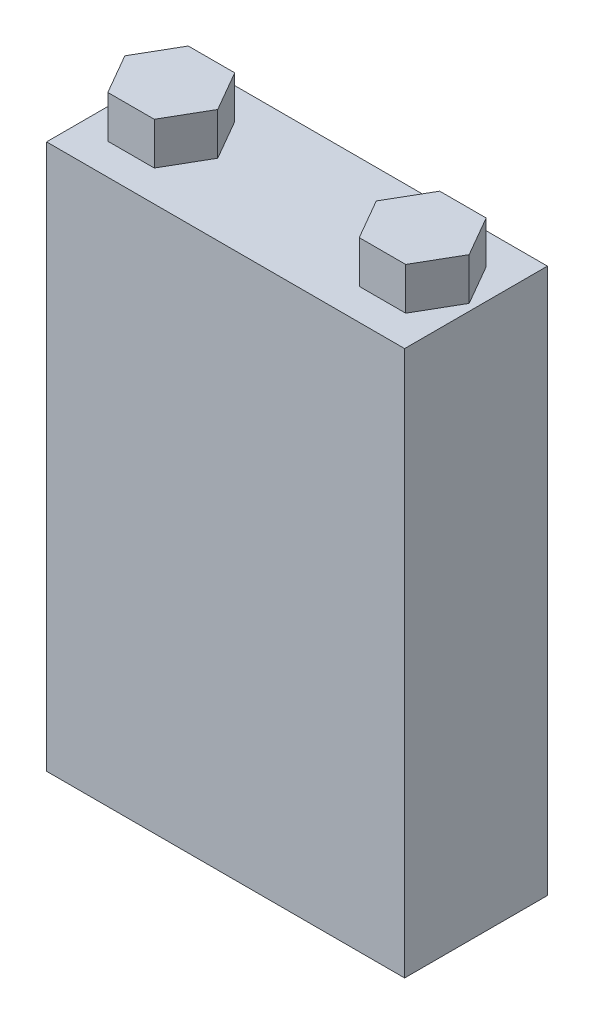
ISO-10303-21;
HEADER;
FILE_DESCRIPTION(('STEP AP214'),'2;1');
FILE_NAME('part.step','',(''),(''),'','','');
FILE_SCHEMA(('AUTOMOTIVE_DESIGN { 1 0 10303 214 1 1 1 1 }'));
ENDSEC;
DATA;
#1=APPLICATION_CONTEXT('core data for automotive mechanical design processes');
#2=APPLICATION_PROTOCOL_DEFINITION('international standard','automotive_design',2000,#1);
#3=PRODUCT_CONTEXT('',#1,'mechanical');
#4=PRODUCT('Part','Part','',(#3));
#5=PRODUCT_RELATED_PRODUCT_CATEGORY('part','',(#4));
#6=PRODUCT_DEFINITION_FORMATION('','',#4);
#7=PRODUCT_DEFINITION_CONTEXT('part definition',#1,'design');
#8=PRODUCT_DEFINITION('design','',#6,#7);
#9=PRODUCT_DEFINITION_SHAPE('','',#8);
#10=(LENGTH_UNIT() NAMED_UNIT(*) SI_UNIT(.MILLI.,.METRE.));
#11=(NAMED_UNIT(*) PLANE_ANGLE_UNIT() SI_UNIT($,.RADIAN.));
#12=(NAMED_UNIT(*) SI_UNIT($,.STERADIAN.) SOLID_ANGLE_UNIT());
#13=UNCERTAINTY_MEASURE_WITH_UNIT(LENGTH_MEASURE(1.E-05),#10,'distance_accuracy_value','');
#14=(GEOMETRIC_REPRESENTATION_CONTEXT(3) GLOBAL_UNCERTAINTY_ASSIGNED_CONTEXT((#13)) GLOBAL_UNIT_ASSIGNED_CONTEXT((#10,
#11,#12)) REPRESENTATION_CONTEXT('',''));
#15=CARTESIAN_POINT('',(0.,0.,0.));
#16=DIRECTION('',(0.,0.,1.));
#17=DIRECTION('',(1.,0.,0.));
#18=AXIS2_PLACEMENT_3D('',#15,#16,#17);
#19=CARTESIAN_POINT('',(0.,271.,0.));
#20=DIRECTION('',(0.,1.,0.));
#21=DIRECTION('',(0.,0.,1.));
#22=AXIS2_PLACEMENT_3D('',#19,#20,#21);
#23=PLANE('',#22);
#24=DIRECTION('',(0.,0.,-1.));
#25=VECTOR('',#24,1.);
#26=CARTESIAN_POINT('',(89.,271.,-35.5));
#27=LINE('',#26,#25);
#28=CARTESIAN_POINT('',(89.,271.,35.5));
#29=VERTEX_POINT('',#28);
#30=CARTESIAN_POINT('',(89.,271.,-35.5));
#31=VERTEX_POINT('',#30);
#32=EDGE_CURVE('E220',#29,#31,#27,.T.);
#33=ORIENTED_EDGE('',*,*,#32,.T.);
#34=DIRECTION('',(-1.,0.,0.));
#35=VECTOR('',#34,1.);
#36=CARTESIAN_POINT('',(-89.,271.,-35.5));
#37=LINE('',#36,#35);
#38=CARTESIAN_POINT('',(-89.,271.,-35.5));
#39=VERTEX_POINT('',#38);
#40=EDGE_CURVE('E223',#31,#39,#37,.T.);
#41=ORIENTED_EDGE('',*,*,#40,.T.);
#42=DIRECTION('',(0.,0.,1.));
#43=VECTOR('',#42,1.);
#44=CARTESIAN_POINT('',(-89.,271.,-35.5));
#45=LINE('',#44,#43);
#46=CARTESIAN_POINT('',(-89.,271.,35.5));
#47=VERTEX_POINT('',#46);
#48=EDGE_CURVE('E226',#39,#47,#45,.T.);
#49=ORIENTED_EDGE('',*,*,#48,.T.);
#50=DIRECTION('',(1.,0.,0.));
#51=VECTOR('',#50,1.);
#52=CARTESIAN_POINT('',(-89.,271.,35.5));
#53=LINE('',#52,#51);
#54=EDGE_CURVE('E228',#47,#29,#53,.T.);
#55=ORIENTED_EDGE('',*,*,#54,.T.);
#56=EDGE_LOOP('',(#33,#41,#49,#55));
#57=FACE_BOUND('',#56,.T.);
#58=DIRECTION('',(-0.5,0.,-0.866025403784439));
#59=VECTOR('',#58,1.);
#60=CARTESIAN_POINT('',(-39.405989232415,271.,0.));
#61=LINE('',#60,#59);
#62=CARTESIAN_POINT('',(-39.405989232415,271.,0.));
#63=VERTEX_POINT('',#62);
#64=CARTESIAN_POINT('',(-50.9529946162075,271.,-20.));
#65=VERTEX_POINT('',#64);
#66=EDGE_CURVE('E176',#63,#65,#61,.T.);
#67=ORIENTED_EDGE('',*,*,#66,.F.);
#68=DIRECTION('',(0.5,0.,-0.866025403784439));
#69=VECTOR('',#68,1.);
#70=CARTESIAN_POINT('',(-50.9529946162075,271.,20.));
#71=LINE('',#70,#69);
#72=CARTESIAN_POINT('',(-50.9529946162075,271.,20.));
#73=VERTEX_POINT('',#72);
#74=EDGE_CURVE('E173',#73,#63,#71,.T.);
#75=ORIENTED_EDGE('',*,*,#74,.F.);
#76=DIRECTION('',(1.,0.,0.));
#77=VECTOR('',#76,1.);
#78=CARTESIAN_POINT('',(-74.0470053837925,271.,20.));
#79=LINE('',#78,#77);
#80=CARTESIAN_POINT('',(-74.0470053837925,271.,20.));
#81=VERTEX_POINT('',#80);
#82=EDGE_CURVE('E186',#81,#73,#79,.T.);
#83=ORIENTED_EDGE('',*,*,#82,.F.);
#84=DIRECTION('',(0.5,0.,0.866025403784439));
#85=VECTOR('',#84,1.);
#86=CARTESIAN_POINT('',(-85.594010767585,271.,0.));
#87=LINE('',#86,#85);
#88=CARTESIAN_POINT('',(-85.594010767585,271.,0.));
#89=VERTEX_POINT('',#88);
#90=EDGE_CURVE('E202',#89,#81,#87,.T.);
#91=ORIENTED_EDGE('',*,*,#90,.F.);
#92=DIRECTION('',(-0.5,0.,0.866025403784439));
#93=VECTOR('',#92,1.);
#94=CARTESIAN_POINT('',(-74.0470053837925,271.,-20.));
#95=LINE('',#94,#93);
#96=CARTESIAN_POINT('',(-74.0470053837925,271.,-20.));
#97=VERTEX_POINT('',#96);
#98=EDGE_CURVE('E200',#97,#89,#95,.T.);
#99=ORIENTED_EDGE('',*,*,#98,.F.);
#100=DIRECTION('',(-1.,0.,0.));
#101=VECTOR('',#100,1.);
#102=CARTESIAN_POINT('',(-50.9529946162075,271.,-20.));
#103=LINE('',#102,#101);
#104=EDGE_CURVE('E198',#65,#97,#103,.T.);
#105=ORIENTED_EDGE('',*,*,#104,.F.);
#106=EDGE_LOOP('',(#67,#75,#83,#91,#99,#105));
#107=FACE_BOUND('',#106,.T.);
#108=DIRECTION('',(-0.5,0.,-0.866025403784439));
#109=VECTOR('',#108,1.);
#110=CARTESIAN_POINT('',(85.594010767585,271.,0.));
#111=LINE('',#110,#109);
#112=CARTESIAN_POINT('',(85.594010767585,271.,0.));
#113=VERTEX_POINT('',#112);
#114=CARTESIAN_POINT('',(74.0470053837925,271.,-20.));
#115=VERTEX_POINT('',#114);
#116=EDGE_CURVE('E450',#113,#115,#111,.T.);
#117=ORIENTED_EDGE('',*,*,#116,.F.);
#118=DIRECTION('',(0.5,0.,-0.866025403784439));
#119=VECTOR('',#118,1.);
#120=CARTESIAN_POINT('',(74.0470053837925,271.,20.));
#121=LINE('',#120,#119);
#122=CARTESIAN_POINT('',(74.0470053837925,271.,20.));
#123=VERTEX_POINT('',#122);
#124=EDGE_CURVE('E171',#123,#113,#121,.T.);
#125=ORIENTED_EDGE('',*,*,#124,.F.);
#126=DIRECTION('',(1.,0.,0.));
#127=VECTOR('',#126,1.);
#128=CARTESIAN_POINT('',(50.9529946162075,271.,20.));
#129=LINE('',#128,#127);
#130=CARTESIAN_POINT('',(50.9529946162075,271.,20.));
#131=VERTEX_POINT('',#130);
#132=EDGE_CURVE('E167',#131,#123,#129,.T.);
#133=ORIENTED_EDGE('',*,*,#132,.F.);
#134=DIRECTION('',(0.499999999999999,0.,0.866025403784439));
#135=VECTOR('',#134,1.);
#136=CARTESIAN_POINT('',(39.405989232415,271.,0.));
#137=LINE('',#136,#135);
#138=CARTESIAN_POINT('',(39.405989232415,271.,0.));
#139=VERTEX_POINT('',#138);
#140=EDGE_CURVE('E446',#139,#131,#137,.T.);
#141=ORIENTED_EDGE('',*,*,#140,.F.);
#142=DIRECTION('',(-0.5,0.,0.866025403784439));
#143=VECTOR('',#142,1.);
#144=CARTESIAN_POINT('',(50.9529946162075,271.,-20.));
#145=LINE('',#144,#143);
#146=CARTESIAN_POINT('',(50.9529946162075,271.,-20.));
#147=VERTEX_POINT('',#146);
#148=EDGE_CURVE('E458',#147,#139,#145,.T.);
#149=ORIENTED_EDGE('',*,*,#148,.F.);
#150=DIRECTION('',(-1.,0.,0.));
#151=VECTOR('',#150,1.);
#152=CARTESIAN_POINT('',(74.0470053837925,271.,-20.));
#153=LINE('',#152,#151);
#154=EDGE_CURVE('E452',#115,#147,#153,.T.);
#155=ORIENTED_EDGE('',*,*,#154,.F.);
#156=EDGE_LOOP('',(#117,#125,#133,#141,#149,#155));
#157=FACE_BOUND('',#156,.T.);
#158=ADVANCED_FACE('F34',(#57,#107,#157),#23,.T.);
#159=CARTESIAN_POINT('',(89.,271.,-35.5));
#160=DIRECTION('',(-1.,0.,0.));
#161=DIRECTION('',(0.,0.,1.));
#162=AXIS2_PLACEMENT_3D('',#159,#160,#161);
#163=PLANE('',#162);
#164=DIRECTION('',(0.,0.,-1.));
#165=VECTOR('',#164,1.);
#166=CARTESIAN_POINT('',(89.,0.,-35.5));
#167=LINE('',#166,#165);
#168=CARTESIAN_POINT('',(89.,0.,35.5));
#169=VERTEX_POINT('',#168);
#170=CARTESIAN_POINT('',(89.,0.,-35.5));
#171=VERTEX_POINT('',#170);
#172=EDGE_CURVE('E219',#169,#171,#167,.T.);
#173=ORIENTED_EDGE('',*,*,#172,.T.);
#174=DIRECTION('',(0.,-1.,0.));
#175=VECTOR('',#174,1.);
#176=CARTESIAN_POINT('',(89.,271.,-35.5));
#177=LINE('',#176,#175);
#178=EDGE_CURVE('E11',#31,#171,#177,.T.);
#179=ORIENTED_EDGE('',*,*,#178,.F.);
#180=ORIENTED_EDGE('',*,*,#32,.F.);
#181=DIRECTION('',(0.,-1.,0.));
#182=VECTOR('',#181,1.);
#183=CARTESIAN_POINT('',(89.,271.,35.5));
#184=LINE('',#183,#182);
#185=EDGE_CURVE('E230',#29,#169,#184,.T.);
#186=ORIENTED_EDGE('',*,*,#185,.T.);
#187=EDGE_LOOP('',(#173,#179,#180,#186));
#188=FACE_BOUND('',#187,.T.);
#189=ADVANCED_FACE('F36',(#188),#163,.F.);
#190=CARTESIAN_POINT('',(-89.,271.,-35.5));
#191=DIRECTION('',(0.,0.,1.));
#192=DIRECTION('',(1.,0.,0.));
#193=AXIS2_PLACEMENT_3D('',#190,#191,#192);
#194=PLANE('',#193);
#195=DIRECTION('',(-1.,0.,0.));
#196=VECTOR('',#195,1.);
#197=CARTESIAN_POINT('',(-89.,0.,-35.5));
#198=LINE('',#197,#196);
#199=CARTESIAN_POINT('',(-89.,0.,-35.5));
#200=VERTEX_POINT('',#199);
#201=EDGE_CURVE('E233',#171,#200,#198,.T.);
#202=ORIENTED_EDGE('',*,*,#201,.T.);
#203=DIRECTION('',(0.,-1.,0.));
#204=VECTOR('',#203,1.);
#205=CARTESIAN_POINT('',(-89.,271.,-35.5));
#206=LINE('',#205,#204);
#207=EDGE_CURVE('E42',#39,#200,#206,.T.);
#208=ORIENTED_EDGE('',*,*,#207,.F.);
#209=ORIENTED_EDGE('',*,*,#40,.F.);
#210=ORIENTED_EDGE('',*,*,#178,.T.);
#211=EDGE_LOOP('',(#202,#208,#209,#210));
#212=FACE_BOUND('',#211,.T.);
#213=ADVANCED_FACE('F263',(#212),#194,.F.);
#214=CARTESIAN_POINT('',(-89.,271.,-35.5));
#215=DIRECTION('',(1.,0.,0.));
#216=DIRECTION('',(0.,0.,-1.));
#217=AXIS2_PLACEMENT_3D('',#214,#215,#216);
#218=PLANE('',#217);
#219=DIRECTION('',(0.,0.,1.));
#220=VECTOR('',#219,1.);
#221=CARTESIAN_POINT('',(-89.,0.,-35.5));
#222=LINE('',#221,#220);
#223=CARTESIAN_POINT('',(-89.,0.,35.5));
#224=VERTEX_POINT('',#223);
#225=EDGE_CURVE('E235',#200,#224,#222,.T.);
#226=ORIENTED_EDGE('',*,*,#225,.T.);
#227=DIRECTION('',(0.,-1.,0.));
#228=VECTOR('',#227,1.);
#229=CARTESIAN_POINT('',(-89.,271.,35.5));
#230=LINE('',#229,#228);
#231=EDGE_CURVE('E240',#47,#224,#230,.T.);
#232=ORIENTED_EDGE('',*,*,#231,.F.);
#233=ORIENTED_EDGE('',*,*,#48,.F.);
#234=ORIENTED_EDGE('',*,*,#207,.T.);
#235=EDGE_LOOP('',(#226,#232,#233,#234));
#236=FACE_BOUND('',#235,.T.);
#237=ADVANCED_FACE('F247',(#236),#218,.F.);
#238=CARTESIAN_POINT('',(-89.,271.,35.5));
#239=DIRECTION('',(0.,0.,-1.));
#240=DIRECTION('',(-1.,0.,0.));
#241=AXIS2_PLACEMENT_3D('',#238,#239,#240);
#242=PLANE('',#241);
#243=DIRECTION('',(1.,0.,0.));
#244=VECTOR('',#243,1.);
#245=CARTESIAN_POINT('',(-89.,0.,35.5));
#246=LINE('',#245,#244);
#247=EDGE_CURVE('E224',#224,#169,#246,.T.);
#248=ORIENTED_EDGE('',*,*,#247,.T.);
#249=ORIENTED_EDGE('',*,*,#185,.F.);
#250=ORIENTED_EDGE('',*,*,#54,.F.);
#251=ORIENTED_EDGE('',*,*,#231,.T.);
#252=EDGE_LOOP('',(#248,#249,#250,#251));
#253=FACE_BOUND('',#252,.T.);
#254=ADVANCED_FACE('F256',(#253),#242,.F.);
#255=CARTESIAN_POINT('',(0.,0.,0.));
#256=DIRECTION('',(0.,1.,0.));
#257=DIRECTION('',(0.,0.,1.));
#258=AXIS2_PLACEMENT_3D('',#255,#256,#257);
#259=PLANE('',#258);
#260=ORIENTED_EDGE('',*,*,#172,.F.);
#261=ORIENTED_EDGE('',*,*,#247,.F.);
#262=ORIENTED_EDGE('',*,*,#225,.F.);
#263=ORIENTED_EDGE('',*,*,#201,.F.);
#264=EDGE_LOOP('',(#260,#261,#262,#263));
#265=FACE_BOUND('',#264,.T.);
#266=ADVANCED_FACE('F253',(#265),#259,.F.);
#267=CARTESIAN_POINT('',(-50.9529946162075,292.,20.));
#268=DIRECTION('',(-0.866025403784439,0.,-0.5));
#269=DIRECTION('',(-0.5,0.,0.866025403784439));
#270=AXIS2_PLACEMENT_3D('',#267,#268,#269);
#271=PLANE('',#270);
#272=ORIENTED_EDGE('',*,*,#74,.T.);
#273=DIRECTION('',(0.,-1.,0.));
#274=VECTOR('',#273,1.);
#275=CARTESIAN_POINT('',(-39.405989232415,292.,0.));
#276=LINE('',#275,#274);
#277=CARTESIAN_POINT('',(-39.405989232415,292.,0.));
#278=VERTEX_POINT('',#277);
#279=EDGE_CURVE('E217',#278,#63,#276,.T.);
#280=ORIENTED_EDGE('',*,*,#279,.F.);
#281=DIRECTION('',(0.5,0.,-0.866025403784439));
#282=VECTOR('',#281,1.);
#283=CARTESIAN_POINT('',(-50.9529946162075,292.,20.));
#284=LINE('',#283,#282);
#285=CARTESIAN_POINT('',(-50.9529946162075,292.,20.));
#286=VERTEX_POINT('',#285);
#287=EDGE_CURVE('E182',#286,#278,#284,.T.);
#288=ORIENTED_EDGE('',*,*,#287,.F.);
#289=DIRECTION('',(0.,-1.,0.));
#290=VECTOR('',#289,1.);
#291=CARTESIAN_POINT('',(-50.9529946162075,292.,20.));
#292=LINE('',#291,#290);
#293=EDGE_CURVE('E195',#286,#73,#292,.T.);
#294=ORIENTED_EDGE('',*,*,#293,.T.);
#295=EDGE_LOOP('',(#272,#280,#288,#294));
#296=FACE_BOUND('',#295,.T.);
#297=ADVANCED_FACE('F276',(#296),#271,.F.);
#298=CARTESIAN_POINT('',(-39.405989232415,292.,0.));
#299=DIRECTION('',(-0.866025403784439,0.,0.5));
#300=DIRECTION('',(0.5,0.,0.866025403784439));
#301=AXIS2_PLACEMENT_3D('',#298,#299,#300);
#302=PLANE('',#301);
#303=ORIENTED_EDGE('',*,*,#66,.T.);
#304=DIRECTION('',(0.,-1.,0.));
#305=VECTOR('',#304,1.);
#306=CARTESIAN_POINT('',(-50.9529946162075,292.,-20.));
#307=LINE('',#306,#305);
#308=CARTESIAN_POINT('',(-50.9529946162075,292.,-20.));
#309=VERTEX_POINT('',#308);
#310=EDGE_CURVE('E214',#309,#65,#307,.T.);
#311=ORIENTED_EDGE('',*,*,#310,.F.);
#312=DIRECTION('',(-0.5,0.,-0.866025403784439));
#313=VECTOR('',#312,1.);
#314=CARTESIAN_POINT('',(-39.405989232415,292.,0.));
#315=LINE('',#314,#313);
#316=EDGE_CURVE('E185',#278,#309,#315,.T.);
#317=ORIENTED_EDGE('',*,*,#316,.F.);
#318=ORIENTED_EDGE('',*,*,#279,.T.);
#319=EDGE_LOOP('',(#303,#311,#317,#318));
#320=FACE_BOUND('',#319,.T.);
#321=ADVANCED_FACE('F295',(#320),#302,.F.);
#322=CARTESIAN_POINT('',(-50.9529946162075,292.,-20.));
#323=DIRECTION('',(0.,0.,1.));
#324=DIRECTION('',(1.,0.,0.));
#325=AXIS2_PLACEMENT_3D('',#322,#323,#324);
#326=PLANE('',#325);
#327=ORIENTED_EDGE('',*,*,#104,.T.);
#328=DIRECTION('',(0.,-1.,0.));
#329=VECTOR('',#328,1.);
#330=CARTESIAN_POINT('',(-74.0470053837925,292.,-20.));
#331=LINE('',#330,#329);
#332=CARTESIAN_POINT('',(-74.0470053837925,292.,-20.));
#333=VERTEX_POINT('',#332);
#334=EDGE_CURVE('E211',#333,#97,#331,.T.);
#335=ORIENTED_EDGE('',*,*,#334,.F.);
#336=DIRECTION('',(-1.,0.,0.));
#337=VECTOR('',#336,1.);
#338=CARTESIAN_POINT('',(-50.9529946162075,292.,-20.));
#339=LINE('',#338,#337);
#340=EDGE_CURVE('E188',#309,#333,#339,.T.);
#341=ORIENTED_EDGE('',*,*,#340,.F.);
#342=ORIENTED_EDGE('',*,*,#310,.T.);
#343=EDGE_LOOP('',(#327,#335,#341,#342));
#344=FACE_BOUND('',#343,.T.);
#345=ADVANCED_FACE('F302',(#344),#326,.F.);
#346=CARTESIAN_POINT('',(-74.0470053837925,292.,-20.));
#347=DIRECTION('',(0.866025403784439,0.,0.5));
#348=DIRECTION('',(0.5,0.,-0.866025403784439));
#349=AXIS2_PLACEMENT_3D('',#346,#347,#348);
#350=PLANE('',#349);
#351=ORIENTED_EDGE('',*,*,#98,.T.);
#352=DIRECTION('',(0.,-1.,0.));
#353=VECTOR('',#352,1.);
#354=CARTESIAN_POINT('',(-85.594010767585,292.,0.));
#355=LINE('',#354,#353);
#356=CARTESIAN_POINT('',(-85.594010767585,292.,0.));
#357=VERTEX_POINT('',#356);
#358=EDGE_CURVE('E208',#357,#89,#355,.T.);
#359=ORIENTED_EDGE('',*,*,#358,.F.);
#360=DIRECTION('',(-0.5,0.,0.866025403784439));
#361=VECTOR('',#360,1.);
#362=CARTESIAN_POINT('',(-74.0470053837925,292.,-20.));
#363=LINE('',#362,#361);
#364=EDGE_CURVE('E190',#333,#357,#363,.T.);
#365=ORIENTED_EDGE('',*,*,#364,.F.);
#366=ORIENTED_EDGE('',*,*,#334,.T.);
#367=EDGE_LOOP('',(#351,#359,#365,#366));
#368=FACE_BOUND('',#367,.T.);
#369=ADVANCED_FACE('F309',(#368),#350,.F.);
#370=CARTESIAN_POINT('',(-85.594010767585,292.,0.));
#371=DIRECTION('',(0.866025403784439,0.,-0.5));
#372=DIRECTION('',(-0.5,0.,-0.866025403784439));
#373=AXIS2_PLACEMENT_3D('',#370,#371,#372);
#374=PLANE('',#373);
#375=ORIENTED_EDGE('',*,*,#90,.T.);
#376=DIRECTION('',(0.,-1.,0.));
#377=VECTOR('',#376,1.);
#378=CARTESIAN_POINT('',(-74.0470053837925,292.,20.));
#379=LINE('',#378,#377);
#380=CARTESIAN_POINT('',(-74.0470053837925,292.,20.));
#381=VERTEX_POINT('',#380);
#382=EDGE_CURVE('E57',#381,#81,#379,.T.);
#383=ORIENTED_EDGE('',*,*,#382,.F.);
#384=DIRECTION('',(0.5,0.,0.866025403784439));
#385=VECTOR('',#384,1.);
#386=CARTESIAN_POINT('',(-85.594010767585,292.,0.));
#387=LINE('',#386,#385);
#388=EDGE_CURVE('E192',#357,#381,#387,.T.);
#389=ORIENTED_EDGE('',*,*,#388,.F.);
#390=ORIENTED_EDGE('',*,*,#358,.T.);
#391=EDGE_LOOP('',(#375,#383,#389,#390));
#392=FACE_BOUND('',#391,.T.);
#393=ADVANCED_FACE('F317',(#392),#374,.F.);
#394=CARTESIAN_POINT('',(-74.0470053837925,292.,20.));
#395=DIRECTION('',(0.,0.,-1.));
#396=DIRECTION('',(-1.,0.,0.));
#397=AXIS2_PLACEMENT_3D('',#394,#395,#396);
#398=PLANE('',#397);
#399=ORIENTED_EDGE('',*,*,#82,.T.);
#400=ORIENTED_EDGE('',*,*,#293,.F.);
#401=DIRECTION('',(1.,0.,0.));
#402=VECTOR('',#401,1.);
#403=CARTESIAN_POINT('',(-74.0470053837925,292.,20.));
#404=LINE('',#403,#402);
#405=EDGE_CURVE('E194',#381,#286,#404,.T.);
#406=ORIENTED_EDGE('',*,*,#405,.F.);
#407=ORIENTED_EDGE('',*,*,#382,.T.);
#408=EDGE_LOOP('',(#399,#400,#406,#407));
#409=FACE_BOUND('',#408,.T.);
#410=ADVANCED_FACE('F325',(#409),#398,.F.);
#411=CARTESIAN_POINT('',(0.,292.,0.));
#412=DIRECTION('',(0.,1.,0.));
#413=DIRECTION('',(0.,0.,1.));
#414=AXIS2_PLACEMENT_3D('',#411,#412,#413);
#415=PLANE('',#414);
#416=ORIENTED_EDGE('',*,*,#287,.T.);
#417=ORIENTED_EDGE('',*,*,#316,.T.);
#418=ORIENTED_EDGE('',*,*,#340,.T.);
#419=ORIENTED_EDGE('',*,*,#364,.T.);
#420=ORIENTED_EDGE('',*,*,#388,.T.);
#421=ORIENTED_EDGE('',*,*,#405,.T.);
#422=EDGE_LOOP('',(#416,#417,#418,#419,#420,#421));
#423=FACE_BOUND('',#422,.T.);
#424=ADVANCED_FACE('F333',(#423),#415,.T.);
#425=CARTESIAN_POINT('',(74.0470053837925,292.,20.));
#426=DIRECTION('',(-0.866025403784439,0.,-0.5));
#427=DIRECTION('',(-0.5,0.,0.866025403784439));
#428=AXIS2_PLACEMENT_3D('',#425,#426,#427);
#429=PLANE('',#428);
#430=ORIENTED_EDGE('',*,*,#124,.T.);
#431=DIRECTION('',(0.,-1.,0.));
#432=VECTOR('',#431,1.);
#433=CARTESIAN_POINT('',(85.594010767585,292.,0.));
#434=LINE('',#433,#432);
#435=CARTESIAN_POINT('',(85.594010767585,292.,0.));
#436=VERTEX_POINT('',#435);
#437=EDGE_CURVE('E152',#436,#113,#434,.T.);
#438=ORIENTED_EDGE('',*,*,#437,.F.);
#439=DIRECTION('',(0.5,0.,-0.866025403784439));
#440=VECTOR('',#439,1.);
#441=CARTESIAN_POINT('',(74.0470053837925,292.,20.));
#442=LINE('',#441,#440);
#443=CARTESIAN_POINT('',(74.0470053837925,292.,20.));
#444=VERTEX_POINT('',#443);
#445=EDGE_CURVE('E159',#444,#436,#442,.T.);
#446=ORIENTED_EDGE('',*,*,#445,.F.);
#447=DIRECTION('',(0.,-1.,0.));
#448=VECTOR('',#447,1.);
#449=CARTESIAN_POINT('',(74.0470053837925,292.,20.));
#450=LINE('',#449,#448);
#451=EDGE_CURVE('E443',#444,#123,#450,.T.);
#452=ORIENTED_EDGE('',*,*,#451,.T.);
#453=EDGE_LOOP('',(#430,#438,#446,#452));
#454=FACE_BOUND('',#453,.T.);
#455=ADVANCED_FACE('F169',(#454),#429,.F.);
#456=CARTESIAN_POINT('',(85.594010767585,292.,0.));
#457=DIRECTION('',(-0.866025403784439,0.,0.5));
#458=DIRECTION('',(0.5,0.,0.866025403784439));
#459=AXIS2_PLACEMENT_3D('',#456,#457,#458);
#460=PLANE('',#459);
#461=ORIENTED_EDGE('',*,*,#116,.T.);
#462=DIRECTION('',(0.,-1.,0.));
#463=VECTOR('',#462,1.);
#464=CARTESIAN_POINT('',(74.0470053837925,292.,-20.));
#465=LINE('',#464,#463);
#466=CARTESIAN_POINT('',(74.0470053837925,292.,-20.));
#467=VERTEX_POINT('',#466);
#468=EDGE_CURVE('E155',#467,#115,#465,.T.);
#469=ORIENTED_EDGE('',*,*,#468,.F.);
#470=DIRECTION('',(-0.5,0.,-0.866025403784439));
#471=VECTOR('',#470,1.);
#472=CARTESIAN_POINT('',(85.594010767585,292.,0.));
#473=LINE('',#472,#471);
#474=EDGE_CURVE('E148',#436,#467,#473,.T.);
#475=ORIENTED_EDGE('',*,*,#474,.F.);
#476=ORIENTED_EDGE('',*,*,#437,.T.);
#477=EDGE_LOOP('',(#461,#469,#475,#476));
#478=FACE_BOUND('',#477,.T.);
#479=ADVANCED_FACE('F150',(#478),#460,.F.);
#480=CARTESIAN_POINT('',(74.0470053837925,292.,-20.));
#481=DIRECTION('',(0.,0.,1.));
#482=DIRECTION('',(1.,0.,0.));
#483=AXIS2_PLACEMENT_3D('',#480,#481,#482);
#484=PLANE('',#483);
#485=ORIENTED_EDGE('',*,*,#154,.T.);
#486=DIRECTION('',(0.,-1.,0.));
#487=VECTOR('',#486,1.);
#488=CARTESIAN_POINT('',(50.9529946162075,292.,-20.));
#489=LINE('',#488,#487);
#490=CARTESIAN_POINT('',(50.9529946162075,292.,-20.));
#491=VERTEX_POINT('',#490);
#492=EDGE_CURVE('E178',#491,#147,#489,.T.);
#493=ORIENTED_EDGE('',*,*,#492,.F.);
#494=DIRECTION('',(-1.,0.,0.));
#495=VECTOR('',#494,1.);
#496=CARTESIAN_POINT('',(74.0470053837925,292.,-20.));
#497=LINE('',#496,#495);
#498=EDGE_CURVE('E158',#467,#491,#497,.T.);
#499=ORIENTED_EDGE('',*,*,#498,.F.);
#500=ORIENTED_EDGE('',*,*,#468,.T.);
#501=EDGE_LOOP('',(#485,#493,#499,#500));
#502=FACE_BOUND('',#501,.T.);
#503=ADVANCED_FACE('F353',(#502),#484,.F.);
#504=CARTESIAN_POINT('',(50.9529946162075,292.,-20.));
#505=DIRECTION('',(0.866025403784439,0.,0.5));
#506=DIRECTION('',(0.5,0.,-0.866025403784439));
#507=AXIS2_PLACEMENT_3D('',#504,#505,#506);
#508=PLANE('',#507);
#509=ORIENTED_EDGE('',*,*,#148,.T.);
#510=DIRECTION('',(0.,-1.,0.));
#511=VECTOR('',#510,1.);
#512=CARTESIAN_POINT('',(39.405989232415,292.,0.));
#513=LINE('',#512,#511);
#514=CARTESIAN_POINT('',(39.405989232415,292.,0.));
#515=VERTEX_POINT('',#514);
#516=EDGE_CURVE('E462',#515,#139,#513,.T.);
#517=ORIENTED_EDGE('',*,*,#516,.F.);
#518=DIRECTION('',(-0.5,0.,0.866025403784439));
#519=VECTOR('',#518,1.);
#520=CARTESIAN_POINT('',(50.9529946162075,292.,-20.));
#521=LINE('',#520,#519);
#522=EDGE_CURVE('E469',#491,#515,#521,.T.);
#523=ORIENTED_EDGE('',*,*,#522,.F.);
#524=ORIENTED_EDGE('',*,*,#492,.T.);
#525=EDGE_LOOP('',(#509,#517,#523,#524));
#526=FACE_BOUND('',#525,.T.);
#527=ADVANCED_FACE('F360',(#526),#508,.F.);
#528=CARTESIAN_POINT('',(39.405989232415,292.,0.));
#529=DIRECTION('',(0.866025403784439,0.,-0.499999999999999));
#530=DIRECTION('',(-0.499999999999999,0.,-0.866025403784439));
#531=AXIS2_PLACEMENT_3D('',#528,#529,#530);
#532=PLANE('',#531);
#533=ORIENTED_EDGE('',*,*,#140,.T.);
#534=DIRECTION('',(0.,-1.,0.));
#535=VECTOR('',#534,1.);
#536=CARTESIAN_POINT('',(50.9529946162075,292.,20.));
#537=LINE('',#536,#535);
#538=CARTESIAN_POINT('',(50.9529946162075,292.,20.));
#539=VERTEX_POINT('',#538);
#540=EDGE_CURVE('E49',#539,#131,#537,.T.);
#541=ORIENTED_EDGE('',*,*,#540,.F.);
#542=DIRECTION('',(0.499999999999999,0.,0.866025403784439));
#543=VECTOR('',#542,1.);
#544=CARTESIAN_POINT('',(39.405989232415,292.,0.));
#545=LINE('',#544,#543);
#546=EDGE_CURVE('E471',#515,#539,#545,.T.);
#547=ORIENTED_EDGE('',*,*,#546,.F.);
#548=ORIENTED_EDGE('',*,*,#516,.T.);
#549=EDGE_LOOP('',(#533,#541,#547,#548));
#550=FACE_BOUND('',#549,.T.);
#551=ADVANCED_FACE('F368',(#550),#532,.F.);
#552=CARTESIAN_POINT('',(50.9529946162075,292.,20.));
#553=DIRECTION('',(0.,0.,-1.));
#554=DIRECTION('',(-1.,0.,0.));
#555=AXIS2_PLACEMENT_3D('',#552,#553,#554);
#556=PLANE('',#555);
#557=ORIENTED_EDGE('',*,*,#132,.T.);
#558=ORIENTED_EDGE('',*,*,#451,.F.);
#559=DIRECTION('',(1.,0.,0.));
#560=VECTOR('',#559,1.);
#561=CARTESIAN_POINT('',(50.9529946162075,292.,20.));
#562=LINE('',#561,#560);
#563=EDGE_CURVE('E163',#539,#444,#562,.T.);
#564=ORIENTED_EDGE('',*,*,#563,.F.);
#565=ORIENTED_EDGE('',*,*,#540,.T.);
#566=EDGE_LOOP('',(#557,#558,#564,#565));
#567=FACE_BOUND('',#566,.T.);
#568=ADVANCED_FACE('F376',(#567),#556,.F.);
#569=CARTESIAN_POINT('',(0.,292.,0.));
#570=DIRECTION('',(0.,1.,0.));
#571=DIRECTION('',(0.,0.,1.));
#572=AXIS2_PLACEMENT_3D('',#569,#570,#571);
#573=PLANE('',#572);
#574=ORIENTED_EDGE('',*,*,#445,.T.);
#575=ORIENTED_EDGE('',*,*,#474,.T.);
#576=ORIENTED_EDGE('',*,*,#498,.T.);
#577=ORIENTED_EDGE('',*,*,#522,.T.);
#578=ORIENTED_EDGE('',*,*,#546,.T.);
#579=ORIENTED_EDGE('',*,*,#563,.T.);
#580=EDGE_LOOP('',(#574,#575,#576,#577,#578,#579));
#581=FACE_BOUND('',#580,.T.);
#582=ADVANCED_FACE('F162',(#581),#573,.T.);
#583=CLOSED_SHELL('',(#158,#189,#213,#237,#254,#266,#297,#321,#345,#369,#393,#410,#424,#455,
#479,#503,#527,#551,#568,#582));
#584=MANIFOLD_SOLID_BREP('B2',#583);
#585=ADVANCED_BREP_SHAPE_REPRESENTATION('',(#18,#584),#14);
#586=SHAPE_DEFINITION_REPRESENTATION(#9,#585);
ENDSEC;
END-ISO-10303-21;
